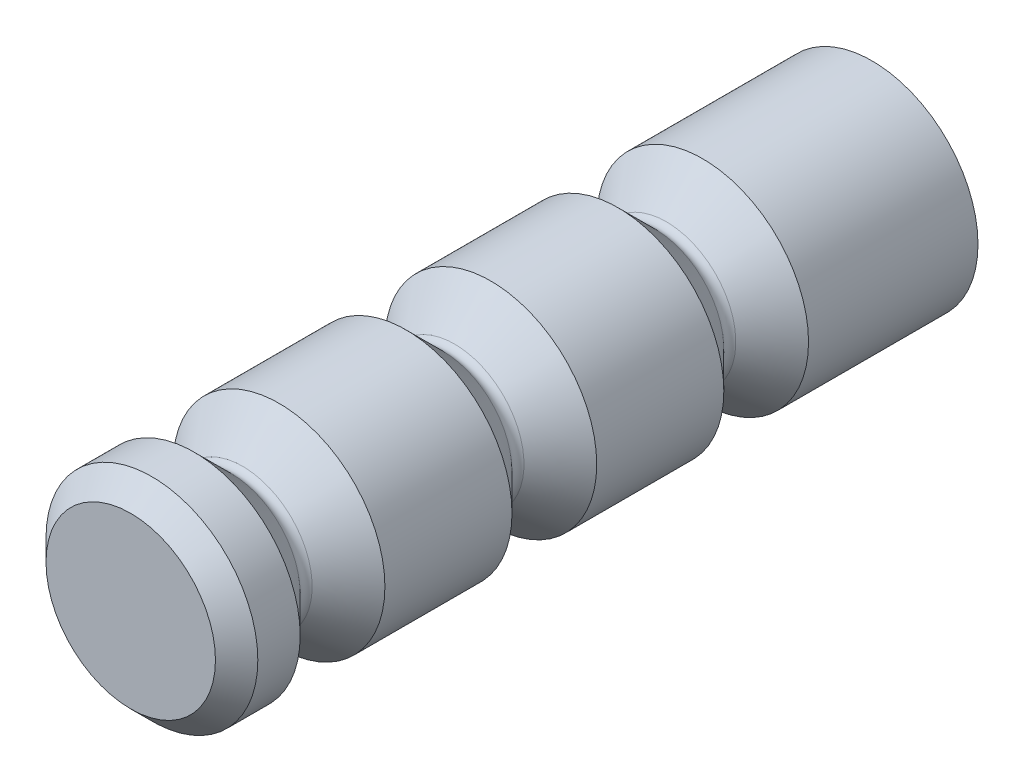
ISO-10303-21;
HEADER;
FILE_DESCRIPTION(('STEP AP214'),'2;1');
FILE_NAME('part.step','',(''),(''),'','','');
FILE_SCHEMA(('AUTOMOTIVE_DESIGN { 1 0 10303 214 1 1 1 1 }'));
ENDSEC;
DATA;
#1=APPLICATION_CONTEXT('core data for automotive mechanical design processes');
#2=APPLICATION_PROTOCOL_DEFINITION('international standard','automotive_design',2000,#1);
#3=PRODUCT_CONTEXT('',#1,'mechanical');
#4=PRODUCT('Part','Part','',(#3));
#5=PRODUCT_RELATED_PRODUCT_CATEGORY('part','',(#4));
#6=PRODUCT_DEFINITION_FORMATION('','',#4);
#7=PRODUCT_DEFINITION_CONTEXT('part definition',#1,'design');
#8=PRODUCT_DEFINITION('design','',#6,#7);
#9=PRODUCT_DEFINITION_SHAPE('','',#8);
#10=(LENGTH_UNIT() NAMED_UNIT(*) SI_UNIT(.MILLI.,.METRE.));
#11=(NAMED_UNIT(*) PLANE_ANGLE_UNIT() SI_UNIT($,.RADIAN.));
#12=(NAMED_UNIT(*) SI_UNIT($,.STERADIAN.) SOLID_ANGLE_UNIT());
#13=UNCERTAINTY_MEASURE_WITH_UNIT(LENGTH_MEASURE(1.E-05),#10,'distance_accuracy_value','');
#14=(GEOMETRIC_REPRESENTATION_CONTEXT(3) GLOBAL_UNCERTAINTY_ASSIGNED_CONTEXT((#13)) GLOBAL_UNIT_ASSIGNED_CONTEXT((#10,
#11,#12)) REPRESENTATION_CONTEXT('',''));
#15=CARTESIAN_POINT('',(0.,0.,0.));
#16=DIRECTION('',(0.,0.,1.));
#17=DIRECTION('',(1.,0.,0.));
#18=AXIS2_PLACEMENT_3D('',#15,#16,#17);
#19=CARTESIAN_POINT('',(0.,0.,0.));
#20=DIRECTION('',(0.,0.,1.));
#21=DIRECTION('',(1.,0.,0.));
#22=AXIS2_PLACEMENT_3D('',#19,#20,#21);
#23=PLANE('',#22);
#24=CARTESIAN_POINT('',(0.,0.,0.));
#25=DIRECTION('',(0.,0.,1.));
#26=DIRECTION('',(1.,0.,0.));
#27=AXIS2_PLACEMENT_3D('',#24,#25,#26);
#28=CIRCLE('',#27,2.5);
#29=CARTESIAN_POINT('',(2.5,0.,0.));
#30=VERTEX_POINT('',#29);
#31=EDGE_CURVE('E66',#30,#30,#28,.T.);
#32=ORIENTED_EDGE('',*,*,#31,.F.);
#33=EDGE_LOOP('',(#32));
#34=FACE_BOUND('',#33,.T.);
#35=CARTESIAN_POINT('',(0.,0.,0.));
#36=DIRECTION('',(0.,0.,-1.));
#37=DIRECTION('',(-1.,0.,0.));
#38=AXIS2_PLACEMENT_3D('',#35,#36,#37);
#39=CIRCLE('',#38,0.79999999999999);
#40=CARTESIAN_POINT('',(-0.79999999999999,0.,0.));
#41=VERTEX_POINT('',#40);
#42=EDGE_CURVE('E39',#41,#41,#39,.T.);
#43=ORIENTED_EDGE('',*,*,#42,.F.);
#44=EDGE_LOOP('',(#43));
#45=FACE_BOUND('',#44,.T.);
#46=ADVANCED_FACE('F17',(#34,#45),#23,.F.);
#47=CARTESIAN_POINT('',(0.,0.,17.5));
#48=DIRECTION('',(0.,0.,-1.));
#49=DIRECTION('',(-1.,0.,0.));
#50=AXIS2_PLACEMENT_3D('',#47,#48,#49);
#51=CYLINDRICAL_SURFACE('',#50,2.5);
#52=CARTESIAN_POINT('',(0.,0.,9.));
#53=DIRECTION('',(0.,0.,-1.));
#54=DIRECTION('',(-1.,0.,0.));
#55=AXIS2_PLACEMENT_3D('',#52,#53,#54);
#56=CIRCLE('',#55,2.5);
#57=CARTESIAN_POINT('',(-2.5,0.,9.));
#58=VERTEX_POINT('',#57);
#59=EDGE_CURVE('E57',#58,#58,#56,.T.);
#60=ORIENTED_EDGE('',*,*,#59,.T.);
#61=EDGE_LOOP('',(#60));
#62=FACE_BOUND('',#61,.T.);
#63=CARTESIAN_POINT('',(0.,0.,6.));
#64=DIRECTION('',(0.,0.,1.));
#65=DIRECTION('',(1.,0.,0.));
#66=AXIS2_PLACEMENT_3D('',#63,#64,#65);
#67=CIRCLE('',#66,2.5);
#68=CARTESIAN_POINT('',(2.5,0.,6.));
#69=VERTEX_POINT('',#68);
#70=EDGE_CURVE('E69',#69,#69,#67,.T.);
#71=ORIENTED_EDGE('',*,*,#70,.T.);
#72=EDGE_LOOP('',(#71));
#73=FACE_BOUND('',#72,.T.);
#74=ADVANCED_FACE('F97',(#62,#73),#51,.T.);
#75=CARTESIAN_POINT('',(0.,0.,6.5));
#76=DIRECTION('',(0.,0.,1.));
#77=DIRECTION('',(1.,0.,0.));
#78=AXIS2_PLACEMENT_3D('',#75,#76,#77);
#79=CONICAL_SURFACE('',#78,3.,0.785398163397446);
#80=CARTESIAN_POINT('',(0.,0.,5.14142135623731));
#81=DIRECTION('',(0.,0.,-1.));
#82=DIRECTION('',(-1.,0.,0.));
#83=AXIS2_PLACEMENT_3D('',#80,#81,#82);
#84=CIRCLE('',#83,1.64142135623731);
#85=CARTESIAN_POINT('',(-1.64142135623731,0.,5.14142135623731));
#86=VERTEX_POINT('',#85);
#87=EDGE_CURVE('E61',#86,#86,#84,.T.);
#88=ORIENTED_EDGE('',*,*,#87,.F.);
#89=EDGE_LOOP('',(#88));
#90=FACE_BOUND('',#89,.T.);
#91=ORIENTED_EDGE('',*,*,#70,.F.);
#92=EDGE_LOOP('',(#91));
#93=FACE_BOUND('',#92,.T.);
#94=ADVANCED_FACE('F104',(#90,#93),#79,.T.);
#95=CARTESIAN_POINT('',(0.,0.,4.85857864376269));
#96=DIRECTION('',(0.,0.,-1.));
#97=DIRECTION('',(-1.,0.,0.));
#98=AXIS2_PLACEMENT_3D('',#95,#96,#97);
#99=CONICAL_SURFACE('',#98,1.64142135623731,0.785398163397446);
#100=CARTESIAN_POINT('',(0.,0.,4.85857864376269));
#101=DIRECTION('',(0.,0.,-1.));
#102=DIRECTION('',(-1.,0.,0.));
#103=AXIS2_PLACEMENT_3D('',#100,#101,#102);
#104=CIRCLE('',#103,1.64142135623731);
#105=CARTESIAN_POINT('',(-1.64142135623731,0.,4.85857864376269));
#106=VERTEX_POINT('',#105);
#107=EDGE_CURVE('E58',#106,#106,#104,.T.);
#108=ORIENTED_EDGE('',*,*,#107,.T.);
#109=EDGE_LOOP('',(#108));
#110=FACE_BOUND('',#109,.T.);
#111=CARTESIAN_POINT('',(0.,0.,4.));
#112=DIRECTION('',(0.,0.,-1.));
#113=DIRECTION('',(-1.,0.,0.));
#114=AXIS2_PLACEMENT_3D('',#111,#112,#113);
#115=CIRCLE('',#114,2.5);
#116=CARTESIAN_POINT('',(-2.5,0.,4.));
#117=VERTEX_POINT('',#116);
#118=EDGE_CURVE('E65',#117,#117,#115,.T.);
#119=ORIENTED_EDGE('',*,*,#118,.F.);
#120=EDGE_LOOP('',(#119));
#121=FACE_BOUND('',#120,.T.);
#122=ADVANCED_FACE('F124',(#110,#121),#99,.T.);
#123=CARTESIAN_POINT('',(0.,0.,5.));
#124=DIRECTION('',(0.,0.,-1.));
#125=DIRECTION('',(-1.,0.,0.));
#126=AXIS2_PLACEMENT_3D('',#123,#124,#125);
#127=TOROIDAL_SURFACE('',#126,1.78284271247462,0.2);
#128=ORIENTED_EDGE('',*,*,#107,.F.);
#129=EDGE_LOOP('',(#128));
#130=FACE_BOUND('',#129,.T.);
#131=ORIENTED_EDGE('',*,*,#87,.T.);
#132=EDGE_LOOP('',(#131));
#133=FACE_BOUND('',#132,.T.);
#134=ADVANCED_FACE('F114',(#130,#133),#127,.F.);
#135=ORIENTED_EDGE('',*,*,#118,.T.);
#136=EDGE_LOOP('',(#135));
#137=FACE_BOUND('',#136,.T.);
#138=ORIENTED_EDGE('',*,*,#31,.T.);
#139=EDGE_LOOP('',(#138));
#140=FACE_BOUND('',#139,.T.);
#141=ADVANCED_FACE('F106',(#137,#140),#51,.T.);
#142=CARTESIAN_POINT('',(0.,0.,11.5));
#143=DIRECTION('',(0.,0.,1.));
#144=DIRECTION('',(1.,0.,0.));
#145=AXIS2_PLACEMENT_3D('',#142,#143,#144);
#146=CONICAL_SURFACE('',#145,3.,0.785398163397446);
#147=CARTESIAN_POINT('',(0.,0.,10.1414213562373));
#148=DIRECTION('',(0.,0.,-1.));
#149=DIRECTION('',(-1.,0.,0.));
#150=AXIS2_PLACEMENT_3D('',#147,#148,#149);
#151=CIRCLE('',#150,1.64142135623731);
#152=CARTESIAN_POINT('',(-1.64142135623731,0.,10.1414213562373));
#153=VERTEX_POINT('',#152);
#154=EDGE_CURVE('E53',#153,#153,#151,.T.);
#155=ORIENTED_EDGE('',*,*,#154,.F.);
#156=EDGE_LOOP('',(#155));
#157=FACE_BOUND('',#156,.T.);
#158=CARTESIAN_POINT('',(0.,0.,11.));
#159=DIRECTION('',(0.,0.,1.));
#160=DIRECTION('',(1.,0.,0.));
#161=AXIS2_PLACEMENT_3D('',#158,#159,#160);
#162=CIRCLE('',#161,2.5);
#163=CARTESIAN_POINT('',(2.5,0.,11.));
#164=VERTEX_POINT('',#163);
#165=EDGE_CURVE('E62',#164,#164,#162,.T.);
#166=ORIENTED_EDGE('',*,*,#165,.F.);
#167=EDGE_LOOP('',(#166));
#168=FACE_BOUND('',#167,.T.);
#169=ADVANCED_FACE('F113',(#157,#168),#146,.T.);
#170=CARTESIAN_POINT('',(0.,0.,9.85857864376269));
#171=DIRECTION('',(0.,0.,-1.));
#172=DIRECTION('',(-1.,0.,0.));
#173=AXIS2_PLACEMENT_3D('',#170,#171,#172);
#174=CONICAL_SURFACE('',#173,1.64142135623731,0.785398163397446);
#175=CARTESIAN_POINT('',(0.,0.,9.85857864376269));
#176=DIRECTION('',(0.,0.,-1.));
#177=DIRECTION('',(-1.,0.,0.));
#178=AXIS2_PLACEMENT_3D('',#175,#176,#177);
#179=CIRCLE('',#178,1.64142135623731);
#180=CARTESIAN_POINT('',(-1.64142135623731,0.,9.85857864376269));
#181=VERTEX_POINT('',#180);
#182=EDGE_CURVE('E50',#181,#181,#179,.T.);
#183=ORIENTED_EDGE('',*,*,#182,.T.);
#184=EDGE_LOOP('',(#183));
#185=FACE_BOUND('',#184,.T.);
#186=ORIENTED_EDGE('',*,*,#59,.F.);
#187=EDGE_LOOP('',(#186));
#188=FACE_BOUND('',#187,.T.);
#189=ADVANCED_FACE('F121',(#185,#188),#174,.T.);
#190=CARTESIAN_POINT('',(0.,0.,10.));
#191=DIRECTION('',(0.,0.,-1.));
#192=DIRECTION('',(-1.,0.,0.));
#193=AXIS2_PLACEMENT_3D('',#190,#191,#192);
#194=TOROIDAL_SURFACE('',#193,1.78284271247462,0.2);
#195=ORIENTED_EDGE('',*,*,#182,.F.);
#196=EDGE_LOOP('',(#195));
#197=FACE_BOUND('',#196,.T.);
#198=ORIENTED_EDGE('',*,*,#154,.T.);
#199=EDGE_LOOP('',(#198));
#200=FACE_BOUND('',#199,.T.);
#201=ADVANCED_FACE('F139',(#197,#200),#194,.F.);
#202=CARTESIAN_POINT('',(0.,0.,14.));
#203=DIRECTION('',(0.,0.,-1.));
#204=DIRECTION('',(-1.,0.,0.));
#205=AXIS2_PLACEMENT_3D('',#202,#203,#204);
#206=CIRCLE('',#205,2.5);
#207=CARTESIAN_POINT('',(-2.5,0.,14.));
#208=VERTEX_POINT('',#207);
#209=EDGE_CURVE('E49',#208,#208,#206,.T.);
#210=ORIENTED_EDGE('',*,*,#209,.T.);
#211=EDGE_LOOP('',(#210));
#212=FACE_BOUND('',#211,.T.);
#213=ORIENTED_EDGE('',*,*,#165,.T.);
#214=EDGE_LOOP('',(#213));
#215=FACE_BOUND('',#214,.T.);
#216=ADVANCED_FACE('F107',(#212,#215),#51,.T.);
#217=CARTESIAN_POINT('',(0.,0.,16.5));
#218=DIRECTION('',(0.,0.,1.));
#219=DIRECTION('',(1.,0.,0.));
#220=AXIS2_PLACEMENT_3D('',#217,#218,#219);
#221=CONICAL_SURFACE('',#220,3.,0.785398163397446);
#222=CARTESIAN_POINT('',(0.,0.,15.1414213562373));
#223=DIRECTION('',(0.,0.,-1.));
#224=DIRECTION('',(-1.,0.,0.));
#225=AXIS2_PLACEMENT_3D('',#222,#223,#224);
#226=CIRCLE('',#225,1.64142135623731);
#227=CARTESIAN_POINT('',(-1.64142135623731,0.,15.1414213562373));
#228=VERTEX_POINT('',#227);
#229=EDGE_CURVE('E42',#228,#228,#226,.T.);
#230=ORIENTED_EDGE('',*,*,#229,.F.);
#231=EDGE_LOOP('',(#230));
#232=FACE_BOUND('',#231,.T.);
#233=CARTESIAN_POINT('',(0.,0.,16.));
#234=DIRECTION('',(0.,0.,1.));
#235=DIRECTION('',(1.,0.,0.));
#236=AXIS2_PLACEMENT_3D('',#233,#234,#235);
#237=CIRCLE('',#236,2.5);
#238=CARTESIAN_POINT('',(2.5,0.,16.));
#239=VERTEX_POINT('',#238);
#240=EDGE_CURVE('E54',#239,#239,#237,.T.);
#241=ORIENTED_EDGE('',*,*,#240,.F.);
#242=EDGE_LOOP('',(#241));
#243=FACE_BOUND('',#242,.T.);
#244=ADVANCED_FACE('F138',(#232,#243),#221,.T.);
#245=CARTESIAN_POINT('',(0.,0.,14.8585786437627));
#246=DIRECTION('',(0.,0.,-1.));
#247=DIRECTION('',(-1.,0.,0.));
#248=AXIS2_PLACEMENT_3D('',#245,#246,#247);
#249=CONICAL_SURFACE('',#248,1.64142135623731,0.785398163397446);
#250=CARTESIAN_POINT('',(0.,0.,14.8585786437627));
#251=DIRECTION('',(0.,0.,-1.));
#252=DIRECTION('',(-1.,0.,0.));
#253=AXIS2_PLACEMENT_3D('',#250,#251,#252);
#254=CIRCLE('',#253,1.64142135623731);
#255=CARTESIAN_POINT('',(-1.64142135623731,0.,14.8585786437627));
#256=VERTEX_POINT('',#255);
#257=EDGE_CURVE('E38',#256,#256,#254,.T.);
#258=ORIENTED_EDGE('',*,*,#257,.T.);
#259=EDGE_LOOP('',(#258));
#260=FACE_BOUND('',#259,.T.);
#261=ORIENTED_EDGE('',*,*,#209,.F.);
#262=EDGE_LOOP('',(#261));
#263=FACE_BOUND('',#262,.T.);
#264=ADVANCED_FACE('F146',(#260,#263),#249,.T.);
#265=CARTESIAN_POINT('',(0.,0.,15.));
#266=DIRECTION('',(0.,0.,-1.));
#267=DIRECTION('',(-1.,0.,0.));
#268=AXIS2_PLACEMENT_3D('',#265,#266,#267);
#269=TOROIDAL_SURFACE('',#268,1.78284271247462,0.2);
#270=ORIENTED_EDGE('',*,*,#257,.F.);
#271=EDGE_LOOP('',(#270));
#272=FACE_BOUND('',#271,.T.);
#273=ORIENTED_EDGE('',*,*,#229,.T.);
#274=EDGE_LOOP('',(#273));
#275=FACE_BOUND('',#274,.T.);
#276=ADVANCED_FACE('F135',(#272,#275),#269,.F.);
#277=CARTESIAN_POINT('',(0.,0.,17.5));
#278=DIRECTION('',(0.,0.,1.));
#279=DIRECTION('',(1.,0.,0.));
#280=AXIS2_PLACEMENT_3D('',#277,#278,#279);
#281=PLANE('',#280);
#282=CARTESIAN_POINT('',(0.,0.,17.5));
#283=DIRECTION('',(0.,0.,1.));
#284=DIRECTION('',(1.,0.,0.));
#285=AXIS2_PLACEMENT_3D('',#282,#283,#284);
#286=CIRCLE('',#285,2.);
#287=CARTESIAN_POINT('',(2.,0.,17.5));
#288=VERTEX_POINT('',#287);
#289=EDGE_CURVE('E25',#288,#288,#286,.T.);
#290=ORIENTED_EDGE('',*,*,#289,.T.);
#291=EDGE_LOOP('',(#290));
#292=FACE_BOUND('',#291,.T.);
#293=ADVANCED_FACE('F84',(#292),#281,.T.);
#294=CARTESIAN_POINT('',(0.,0.,17.));
#295=DIRECTION('',(0.,0.,1.));
#296=DIRECTION('',(1.,0.,0.));
#297=AXIS2_PLACEMENT_3D('',#294,#295,#296);
#298=CIRCLE('',#297,2.5);
#299=CARTESIAN_POINT('',(2.5,0.,17.));
#300=VERTEX_POINT('',#299);
#301=EDGE_CURVE('E11',#300,#300,#298,.F.);
#302=ORIENTED_EDGE('',*,*,#301,.T.);
#303=EDGE_LOOP('',(#302));
#304=FACE_BOUND('',#303,.T.);
#305=ORIENTED_EDGE('',*,*,#240,.T.);
#306=EDGE_LOOP('',(#305));
#307=FACE_BOUND('',#306,.T.);
#308=ADVANCED_FACE('F32',(#304,#307),#51,.T.);
#309=CARTESIAN_POINT('',(0.,0.,4.71931150477795));
#310=DIRECTION('',(0.,0.,-1.));
#311=DIRECTION('',(-1.,0.,0.));
#312=AXIS2_PLACEMENT_3D('',#309,#310,#311);
#313=CONICAL_SURFACE('',#312,0.8,1.02974425867665);
#314=CARTESIAN_POINT('',(0.,0.,5.2));
#315=VERTEX_POINT('',#314);
#316=VERTEX_LOOP('',#315);
#317=FACE_BOUND('',#316,.T.);
#318=CARTESIAN_POINT('',(0.,0.,4.71931150477795));
#319=DIRECTION('',(0.,0.,-1.));
#320=DIRECTION('',(-1.,0.,0.));
#321=AXIS2_PLACEMENT_3D('',#318,#319,#320);
#322=CIRCLE('',#321,0.8);
#323=CARTESIAN_POINT('',(-0.8,0.,4.71931150477795));
#324=VERTEX_POINT('',#323);
#325=EDGE_CURVE('E36',#324,#324,#322,.T.);
#326=ORIENTED_EDGE('',*,*,#325,.T.);
#327=EDGE_LOOP('',(#326));
#328=FACE_BOUND('',#327,.T.);
#329=ADVANCED_FACE('F28',(#317,#328),#313,.F.);
#330=CARTESIAN_POINT('',(0.,0.,0.));
#331=DIRECTION('',(0.,0.,-1.));
#332=DIRECTION('',(-1.,0.,0.));
#333=AXIS2_PLACEMENT_3D('',#330,#331,#332);
#334=CYLINDRICAL_SURFACE('',#333,0.8);
#335=ORIENTED_EDGE('',*,*,#325,.F.);
#336=EDGE_LOOP('',(#335));
#337=FACE_BOUND('',#336,.T.);
#338=ORIENTED_EDGE('',*,*,#42,.T.);
#339=EDGE_LOOP('',(#338));
#340=FACE_BOUND('',#339,.T.);
#341=ADVANCED_FACE('F31',(#337,#340),#334,.F.);
#342=CARTESIAN_POINT('',(0.,0.,17.5));
#343=DIRECTION('',(0.,0.,-1.));
#344=DIRECTION('',(-1.,0.,0.));
#345=AXIS2_PLACEMENT_3D('',#342,#343,#344);
#346=CONICAL_SURFACE('',#345,2.,0.785398163397445);
#347=ORIENTED_EDGE('',*,*,#301,.F.);
#348=EDGE_LOOP('',(#347));
#349=FACE_BOUND('',#348,.T.);
#350=ORIENTED_EDGE('',*,*,#289,.F.);
#351=EDGE_LOOP('',(#350));
#352=FACE_BOUND('',#351,.T.);
#353=ADVANCED_FACE('F20',(#349,#352),#346,.T.);
#354=CLOSED_SHELL('',(#46,#74,#94,#122,#134,#141,#169,#189,#201,#216,#244,#264,#276,#293,#308,
#329,#341,#353));
#355=MANIFOLD_SOLID_BREP('B1',#354);
#356=ADVANCED_BREP_SHAPE_REPRESENTATION('',(#18,#355),#14);
#357=SHAPE_DEFINITION_REPRESENTATION(#9,#356);
ENDSEC;
END-ISO-10303-21;
